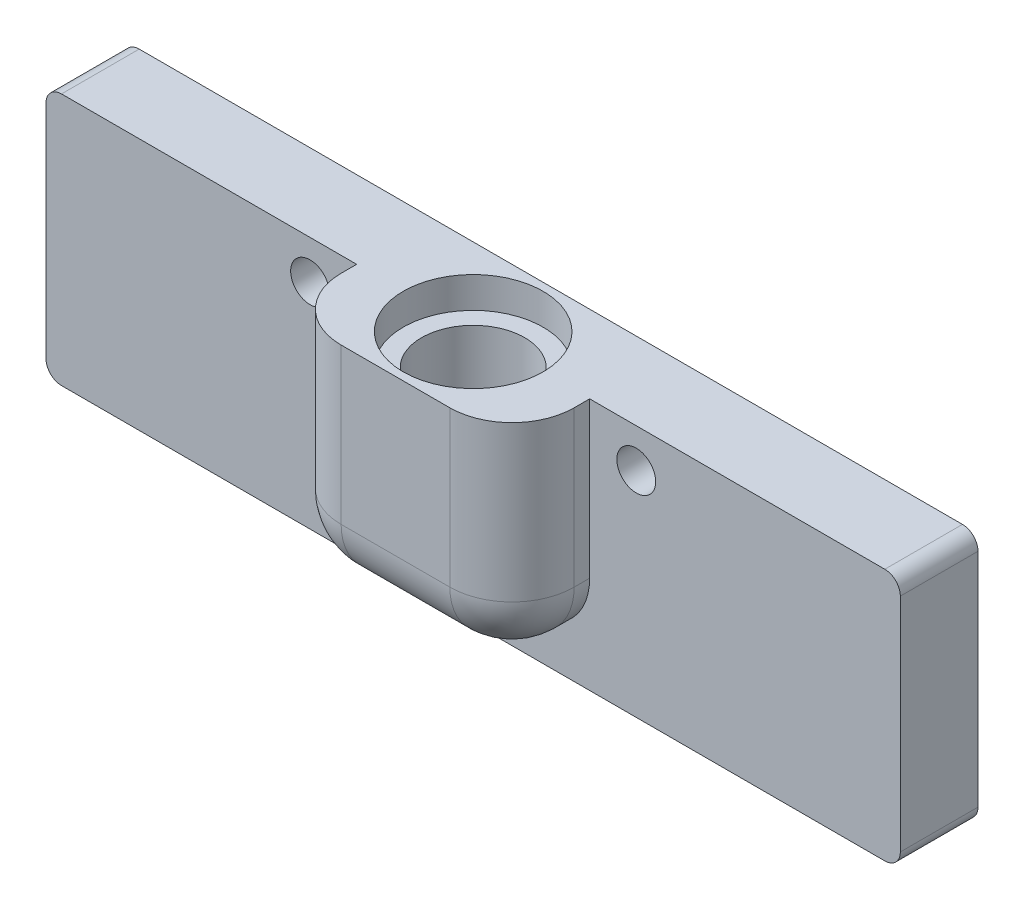
ISO-10303-21;
HEADER;
FILE_DESCRIPTION(('STEP AP214'),'2;1');
FILE_NAME('part.step','',(''),(''),'','','');
FILE_SCHEMA(('AUTOMOTIVE_DESIGN { 1 0 10303 214 1 1 1 1 }'));
ENDSEC;
DATA;
#1=APPLICATION_CONTEXT('core data for automotive mechanical design processes');
#2=APPLICATION_PROTOCOL_DEFINITION('international standard','automotive_design',2000,#1);
#3=PRODUCT_CONTEXT('',#1,'mechanical');
#4=PRODUCT('Part','Part','',(#3));
#5=PRODUCT_RELATED_PRODUCT_CATEGORY('part','',(#4));
#6=PRODUCT_DEFINITION_FORMATION('','',#4);
#7=PRODUCT_DEFINITION_CONTEXT('part definition',#1,'design');
#8=PRODUCT_DEFINITION('design','',#6,#7);
#9=PRODUCT_DEFINITION_SHAPE('','',#8);
#10=(LENGTH_UNIT() NAMED_UNIT(*) SI_UNIT(.MILLI.,.METRE.));
#11=(NAMED_UNIT(*) PLANE_ANGLE_UNIT() SI_UNIT($,.RADIAN.));
#12=(NAMED_UNIT(*) SI_UNIT($,.STERADIAN.) SOLID_ANGLE_UNIT());
#13=UNCERTAINTY_MEASURE_WITH_UNIT(LENGTH_MEASURE(1.E-05),#10,'distance_accuracy_value','');
#14=(GEOMETRIC_REPRESENTATION_CONTEXT(3) GLOBAL_UNCERTAINTY_ASSIGNED_CONTEXT((#13)) GLOBAL_UNIT_ASSIGNED_CONTEXT((#10,
#11,#12)) REPRESENTATION_CONTEXT('',''));
#15=CARTESIAN_POINT('',(0.,0.,0.));
#16=DIRECTION('',(0.,0.,1.));
#17=DIRECTION('',(1.,0.,0.));
#18=AXIS2_PLACEMENT_3D('',#15,#16,#17);
#19=CARTESIAN_POINT('',(0.,0.,5.));
#20=DIRECTION('',(0.,0.,-1.));
#21=DIRECTION('',(-1.,0.,0.));
#22=AXIS2_PLACEMENT_3D('',#19,#20,#21);
#23=PLANE('',#22);
#24=CARTESIAN_POINT('',(-10.5,-2.50000000679029,5.));
#25=DIRECTION('',(0.,0.,1.));
#26=DIRECTION('',(1.,0.,0.));
#27=AXIS2_PLACEMENT_3D('',#24,#25,#26);
#28=CIRCLE('',#27,1.24999999999999);
#29=CARTESIAN_POINT('',(-9.25000000000001,-2.50000000679029,5.));
#30=VERTEX_POINT('',#29);
#31=EDGE_CURVE('E291',#30,#30,#28,.T.);
#32=ORIENTED_EDGE('',*,*,#31,.F.);
#33=EDGE_LOOP('',(#32));
#34=FACE_BOUND('',#33,.T.);
#35=DIRECTION('',(-1.,0.,0.));
#36=VECTOR('',#35,1.);
#37=CARTESIAN_POINT('',(-27.5000000737673,-16.2630756067663,5.));
#38=LINE('',#37,#36);
#39=CARTESIAN_POINT('',(26.5,-16.2630756067663,5.));
#40=VERTEX_POINT('',#39);
#41=CARTESIAN_POINT('',(-26.5000000737673,-16.2630756067663,5.));
#42=VERTEX_POINT('',#41);
#43=EDGE_CURVE('E178',#40,#42,#38,.T.);
#44=ORIENTED_EDGE('',*,*,#43,.F.);
#45=CARTESIAN_POINT('',(26.5,-15.2630756067663,5.));
#46=DIRECTION('',(0.,0.,-1.));
#47=DIRECTION('',(-1.,0.,0.));
#48=AXIS2_PLACEMENT_3D('',#45,#46,#47);
#49=CIRCLE('',#48,1.);
#50=CARTESIAN_POINT('',(27.5,-15.2630756067663,5.));
#51=VERTEX_POINT('',#50);
#52=EDGE_CURVE('E437',#40,#51,#49,.F.);
#53=ORIENTED_EDGE('',*,*,#52,.T.);
#54=DIRECTION('',(0.,-1.,0.));
#55=VECTOR('',#54,1.);
#56=CARTESIAN_POINT('',(27.5,-6.79029728761856E-09,5.));
#57=LINE('',#56,#55);
#58=CARTESIAN_POINT('',(27.5,-1.0000000067903,5.));
#59=VERTEX_POINT('',#58);
#60=EDGE_CURVE('E199',#59,#51,#57,.T.);
#61=ORIENTED_EDGE('',*,*,#60,.F.);
#62=CARTESIAN_POINT('',(26.5,-1.0000000067903,5.));
#63=DIRECTION('',(0.,0.,-1.));
#64=DIRECTION('',(-1.,0.,0.));
#65=AXIS2_PLACEMENT_3D('',#62,#63,#64);
#66=CIRCLE('',#65,1.);
#67=CARTESIAN_POINT('',(26.5,-6.79029716515388E-09,5.));
#68=VERTEX_POINT('',#67);
#69=EDGE_CURVE('E440',#59,#68,#66,.F.);
#70=ORIENTED_EDGE('',*,*,#69,.T.);
#71=DIRECTION('',(1.,0.,0.));
#72=VECTOR('',#71,1.);
#73=CARTESIAN_POINT('',(-27.5000000737673,-6.79029055206115E-09,5.));
#74=LINE('',#73,#72);
#75=CARTESIAN_POINT('',(7.5,-6.79029483832496E-09,5.));
#76=VERTEX_POINT('',#75);
#77=EDGE_CURVE('E220',#76,#68,#74,.T.);
#78=ORIENTED_EDGE('',*,*,#77,.F.);
#79=DIRECTION('',(0.,1.,0.));
#80=VECTOR('',#79,1.);
#81=CARTESIAN_POINT('',(7.5,0.,5.));
#82=LINE('',#81,#80);
#83=CARTESIAN_POINT('',(7.5,-10.,5.));
#84=VERTEX_POINT('',#83);
#85=EDGE_CURVE('E173',#84,#76,#82,.T.);
#86=ORIENTED_EDGE('',*,*,#85,.F.);
#87=CARTESIAN_POINT('',(3.5,-10.,5.));
#88=DIRECTION('',(0.,0.,-1.));
#89=DIRECTION('',(-1.,0.,0.));
#90=AXIS2_PLACEMENT_3D('',#87,#88,#89);
#91=CIRCLE('',#90,4.);
#92=CARTESIAN_POINT('',(3.5,-14.,5.));
#93=VERTEX_POINT('',#92);
#94=EDGE_CURVE('E42',#84,#93,#91,.T.);
#95=ORIENTED_EDGE('',*,*,#94,.T.);
#96=DIRECTION('',(1.,0.,0.));
#97=VECTOR('',#96,1.);
#98=CARTESIAN_POINT('',(7.5,-14.,5.));
#99=LINE('',#98,#97);
#100=CARTESIAN_POINT('',(-3.5,-14.,5.));
#101=VERTEX_POINT('',#100);
#102=EDGE_CURVE('E162',#101,#93,#99,.T.);
#103=ORIENTED_EDGE('',*,*,#102,.F.);
#104=CARTESIAN_POINT('',(-3.5,-10.,5.));
#105=DIRECTION('',(0.,0.,-1.));
#106=DIRECTION('',(-1.,0.,0.));
#107=AXIS2_PLACEMENT_3D('',#104,#105,#106);
#108=CIRCLE('',#107,4.);
#109=CARTESIAN_POINT('',(-7.5,-10.,5.));
#110=VERTEX_POINT('',#109);
#111=EDGE_CURVE('E11',#101,#110,#108,.T.);
#112=ORIENTED_EDGE('',*,*,#111,.T.);
#113=DIRECTION('',(0.,-1.,0.));
#114=VECTOR('',#113,1.);
#115=CARTESIAN_POINT('',(-7.5,-14.,5.));
#116=LINE('',#115,#114);
#117=CARTESIAN_POINT('',(-7.5,-6.79029300135476E-09,5.));
#118=VERTEX_POINT('',#117);
#119=EDGE_CURVE('E159',#118,#110,#116,.T.);
#120=ORIENTED_EDGE('',*,*,#119,.F.);
#121=CARTESIAN_POINT('',(-26.5000000737673,-6.79029067452583E-09,5.));
#122=VERTEX_POINT('',#121);
#123=EDGE_CURVE('E216',#122,#118,#74,.T.);
#124=ORIENTED_EDGE('',*,*,#123,.F.);
#125=CARTESIAN_POINT('',(-26.5000000737673,-1.00000000679029,5.));
#126=DIRECTION('',(0.,0.,-1.));
#127=DIRECTION('',(-1.,0.,0.));
#128=AXIS2_PLACEMENT_3D('',#125,#126,#127);
#129=CIRCLE('',#128,1.);
#130=CARTESIAN_POINT('',(-27.5000000737673,-1.00000000679029,5.));
#131=VERTEX_POINT('',#130);
#132=EDGE_CURVE('E215',#122,#131,#129,.F.);
#133=ORIENTED_EDGE('',*,*,#132,.T.);
#134=DIRECTION('',(0.,1.,0.));
#135=VECTOR('',#134,1.);
#136=CARTESIAN_POINT('',(-27.5000000737673,-16.2630756067663,5.));
#137=LINE('',#136,#135);
#138=CARTESIAN_POINT('',(-27.5000000737673,-15.2630756067663,5.));
#139=VERTEX_POINT('',#138);
#140=EDGE_CURVE('E224',#139,#131,#137,.T.);
#141=ORIENTED_EDGE('',*,*,#140,.F.);
#142=CARTESIAN_POINT('',(-26.5000000737673,-15.2630756067663,5.));
#143=DIRECTION('',(0.,0.,-1.));
#144=DIRECTION('',(-1.,0.,0.));
#145=AXIS2_PLACEMENT_3D('',#142,#143,#144);
#146=CIRCLE('',#145,1.);
#147=EDGE_CURVE('E439',#139,#42,#146,.F.);
#148=ORIENTED_EDGE('',*,*,#147,.T.);
#149=EDGE_LOOP('',(#44,#53,#61,#70,#78,#86,#95,#103,#112,#120,#124,#133,#141,#148));
#150=FACE_BOUND('',#149,.T.);
#151=CARTESIAN_POINT('',(10.5,-2.50000000679029,5.));
#152=DIRECTION('',(0.,0.,1.));
#153=DIRECTION('',(1.,0.,0.));
#154=AXIS2_PLACEMENT_3D('',#151,#152,#153);
#155=CIRCLE('',#154,1.24999999999999);
#156=CARTESIAN_POINT('',(11.75,-2.50000000679029,5.));
#157=VERTEX_POINT('',#156);
#158=EDGE_CURVE('E285',#157,#157,#155,.T.);
#159=ORIENTED_EDGE('',*,*,#158,.F.);
#160=EDGE_LOOP('',(#159));
#161=FACE_BOUND('',#160,.T.);
#162=ADVANCED_FACE('F33',(#34,#150,#161),#23,.F.);
#163=CARTESIAN_POINT('',(-27.5000000737673,-16.2630756067663,5.));
#164=DIRECTION('',(0.,-1.,0.));
#165=DIRECTION('',(1.,0.,0.));
#166=AXIS2_PLACEMENT_3D('',#163,#164,#165);
#167=PLANE('',#166);
#168=DIRECTION('',(-1.,0.,0.));
#169=VECTOR('',#168,1.);
#170=CARTESIAN_POINT('',(-27.5000000737673,-16.2630756067663,0.));
#171=LINE('',#170,#169);
#172=CARTESIAN_POINT('',(26.5,-16.2630756067663,0.));
#173=VERTEX_POINT('',#172);
#174=CARTESIAN_POINT('',(-26.5000000737673,-16.2630756067663,0.));
#175=VERTEX_POINT('',#174);
#176=EDGE_CURVE('E239',#173,#175,#171,.T.);
#177=ORIENTED_EDGE('',*,*,#176,.F.);
#178=DIRECTION('',(0.,0.,-1.));
#179=VECTOR('',#178,1.);
#180=CARTESIAN_POINT('',(26.5,-16.2630756067663,5.));
#181=LINE('',#180,#179);
#182=EDGE_CURVE('E213',#173,#40,#181,.F.);
#183=ORIENTED_EDGE('',*,*,#182,.T.);
#184=ORIENTED_EDGE('',*,*,#43,.T.);
#185=DIRECTION('',(0.,0.,-1.));
#186=VECTOR('',#185,1.);
#187=CARTESIAN_POINT('',(-26.5000000737673,-16.2630756067663,5.));
#188=LINE('',#187,#186);
#189=EDGE_CURVE('E210',#42,#175,#188,.T.);
#190=ORIENTED_EDGE('',*,*,#189,.T.);
#191=EDGE_LOOP('',(#177,#183,#184,#190));
#192=FACE_BOUND('',#191,.T.);
#193=ADVANCED_FACE('F298',(#192),#167,.T.);
#194=CARTESIAN_POINT('',(27.5,-6.79029728761856E-09,5.));
#195=DIRECTION('',(1.,0.,0.));
#196=DIRECTION('',(0.,1.,0.));
#197=AXIS2_PLACEMENT_3D('',#194,#195,#196);
#198=PLANE('',#197);
#199=ORIENTED_EDGE('',*,*,#60,.T.);
#200=DIRECTION('',(0.,0.,-1.));
#201=VECTOR('',#200,1.);
#202=CARTESIAN_POINT('',(27.5,-15.2630756067663,5.));
#203=LINE('',#202,#201);
#204=CARTESIAN_POINT('',(27.5,-15.2630756067663,0.));
#205=VERTEX_POINT('',#204);
#206=EDGE_CURVE('E198',#51,#205,#203,.T.);
#207=ORIENTED_EDGE('',*,*,#206,.T.);
#208=DIRECTION('',(0.,-1.,0.));
#209=VECTOR('',#208,1.);
#210=CARTESIAN_POINT('',(27.5,-6.79029728761856E-09,0.));
#211=LINE('',#210,#209);
#212=CARTESIAN_POINT('',(27.5,-1.0000000067903,0.));
#213=VERTEX_POINT('',#212);
#214=EDGE_CURVE('E230',#213,#205,#211,.T.);
#215=ORIENTED_EDGE('',*,*,#214,.F.);
#216=DIRECTION('',(0.,0.,-1.));
#217=VECTOR('',#216,1.);
#218=CARTESIAN_POINT('',(27.5,-1.0000000067903,5.));
#219=LINE('',#218,#217);
#220=EDGE_CURVE('E196',#213,#59,#219,.F.);
#221=ORIENTED_EDGE('',*,*,#220,.T.);
#222=EDGE_LOOP('',(#199,#207,#215,#221));
#223=FACE_BOUND('',#222,.T.);
#224=ADVANCED_FACE('F352',(#223),#198,.T.);
#225=CARTESIAN_POINT('',(-27.5000000737673,-6.79029055206115E-09,5.));
#226=DIRECTION('',(0.,1.,0.));
#227=DIRECTION('',(-1.,0.,0.));
#228=AXIS2_PLACEMENT_3D('',#225,#226,#227);
#229=PLANE('',#228);
#230=CARTESIAN_POINT('',(0.,0.,5.));
#231=DIRECTION('',(0.,1.,0.));
#232=DIRECTION('',(0.,0.,1.));
#233=AXIS2_PLACEMENT_3D('',#230,#231,#232);
#234=CIRCLE('',#233,4.49999999999999);
#235=CARTESIAN_POINT('',(0.,0.,9.49999999999999));
#236=VERTEX_POINT('',#235);
#237=EDGE_CURVE('E275',#236,#236,#234,.T.);
#238=ORIENTED_EDGE('',*,*,#237,.F.);
#239=EDGE_LOOP('',(#238));
#240=FACE_BOUND('',#239,.T.);
#241=DIRECTION('',(-1.,0.,0.));
#242=VECTOR('',#241,1.);
#243=CARTESIAN_POINT('',(-7.5,0.,10.));
#244=LINE('',#243,#242);
#245=CARTESIAN_POINT('',(3.5,0.,10.));
#246=VERTEX_POINT('',#245);
#247=CARTESIAN_POINT('',(-3.5,0.,10.));
#248=VERTEX_POINT('',#247);
#249=EDGE_CURVE('E169',#246,#248,#244,.T.);
#250=ORIENTED_EDGE('',*,*,#249,.F.);
#251=CARTESIAN_POINT('',(3.5,-6.79029434846624E-09,6.));
#252=DIRECTION('',(0.,1.,0.));
#253=DIRECTION('',(-1.,0.,0.));
#254=AXIS2_PLACEMENT_3D('',#251,#252,#253);
#255=CIRCLE('',#254,4.);
#256=CARTESIAN_POINT('',(7.5,0.,6.));
#257=VERTEX_POINT('',#256);
#258=EDGE_CURVE('E251',#246,#257,#255,.T.);
#259=ORIENTED_EDGE('',*,*,#258,.T.);
#260=DIRECTION('',(0.,0.,-1.));
#261=VECTOR('',#260,1.);
#262=CARTESIAN_POINT('',(7.5,0.,10.));
#263=LINE('',#262,#261);
#264=EDGE_CURVE('E172',#257,#76,#263,.T.);
#265=ORIENTED_EDGE('',*,*,#264,.T.);
#266=ORIENTED_EDGE('',*,*,#77,.T.);
#267=DIRECTION('',(0.,0.,-1.));
#268=VECTOR('',#267,1.);
#269=CARTESIAN_POINT('',(26.5,-6.79029716515388E-09,5.));
#270=LINE('',#269,#268);
#271=CARTESIAN_POINT('',(26.5,-6.79029716515388E-09,0.));
#272=VERTEX_POINT('',#271);
#273=EDGE_CURVE('E184',#68,#272,#270,.T.);
#274=ORIENTED_EDGE('',*,*,#273,.T.);
#275=DIRECTION('',(1.,0.,0.));
#276=VECTOR('',#275,1.);
#277=CARTESIAN_POINT('',(-27.5000000737673,-6.79029055206115E-09,0.));
#278=LINE('',#277,#276);
#279=CARTESIAN_POINT('',(-26.5000000737673,-6.79029067452583E-09,0.));
#280=VERTEX_POINT('',#279);
#281=EDGE_CURVE('E234',#280,#272,#278,.T.);
#282=ORIENTED_EDGE('',*,*,#281,.F.);
#283=DIRECTION('',(0.,0.,-1.));
#284=VECTOR('',#283,1.);
#285=CARTESIAN_POINT('',(-26.5000000737673,-6.79029067452583E-09,5.));
#286=LINE('',#285,#284);
#287=EDGE_CURVE('E426',#280,#122,#286,.F.);
#288=ORIENTED_EDGE('',*,*,#287,.T.);
#289=ORIENTED_EDGE('',*,*,#123,.T.);
#290=DIRECTION('',(0.,0.,-1.));
#291=VECTOR('',#290,1.);
#292=CARTESIAN_POINT('',(-7.5,0.,10.));
#293=LINE('',#292,#291);
#294=CARTESIAN_POINT('',(-7.5,0.,6.));
#295=VERTEX_POINT('',#294);
#296=EDGE_CURVE('E188',#295,#118,#293,.T.);
#297=ORIENTED_EDGE('',*,*,#296,.F.);
#298=CARTESIAN_POINT('',(-3.5,-6.79029349121348E-09,6.));
#299=DIRECTION('',(0.,1.,0.));
#300=DIRECTION('',(-1.,0.,0.));
#301=AXIS2_PLACEMENT_3D('',#298,#299,#300);
#302=CIRCLE('',#301,4.);
#303=EDGE_CURVE('E249',#295,#248,#302,.T.);
#304=ORIENTED_EDGE('',*,*,#303,.T.);
#305=EDGE_LOOP('',(#250,#259,#265,#266,#274,#282,#288,#289,#297,#304));
#306=FACE_BOUND('',#305,.T.);
#307=ADVANCED_FACE('F355',(#240,#306),#229,.T.);
#308=CARTESIAN_POINT('',(-27.5000000737673,-16.2630756067663,5.));
#309=DIRECTION('',(-1.,0.,0.));
#310=DIRECTION('',(0.,0.,1.));
#311=AXIS2_PLACEMENT_3D('',#308,#309,#310);
#312=PLANE('',#311);
#313=DIRECTION('',(0.,1.,0.));
#314=VECTOR('',#313,1.);
#315=CARTESIAN_POINT('',(-27.5000000737673,-16.2630756067663,0.));
#316=LINE('',#315,#314);
#317=CARTESIAN_POINT('',(-27.5000000737673,-15.2630756067663,0.));
#318=VERTEX_POINT('',#317);
#319=CARTESIAN_POINT('',(-27.5000000737673,-1.00000000679029,0.));
#320=VERTEX_POINT('',#319);
#321=EDGE_CURVE('E237',#318,#320,#316,.T.);
#322=ORIENTED_EDGE('',*,*,#321,.F.);
#323=DIRECTION('',(0.,0.,-1.));
#324=VECTOR('',#323,1.);
#325=CARTESIAN_POINT('',(-27.5000000737673,-15.2630756067663,5.));
#326=LINE('',#325,#324);
#327=EDGE_CURVE('E429',#318,#139,#326,.F.);
#328=ORIENTED_EDGE('',*,*,#327,.T.);
#329=ORIENTED_EDGE('',*,*,#140,.T.);
#330=DIRECTION('',(0.,0.,-1.));
#331=VECTOR('',#330,1.);
#332=CARTESIAN_POINT('',(-27.5000000737673,-1.00000000679029,5.));
#333=LINE('',#332,#331);
#334=EDGE_CURVE('E432',#131,#320,#333,.T.);
#335=ORIENTED_EDGE('',*,*,#334,.T.);
#336=EDGE_LOOP('',(#322,#328,#329,#335));
#337=FACE_BOUND('',#336,.T.);
#338=ADVANCED_FACE('F350',(#337),#312,.T.);
#339=CARTESIAN_POINT('',(0.,0.,0.));
#340=DIRECTION('',(0.,0.,-1.));
#341=DIRECTION('',(-1.,0.,0.));
#342=AXIS2_PLACEMENT_3D('',#339,#340,#341);
#343=PLANE('',#342);
#344=CARTESIAN_POINT('',(-10.5,-2.50000000679029,0.));
#345=DIRECTION('',(0.,0.,1.));
#346=DIRECTION('',(1.,0.,0.));
#347=AXIS2_PLACEMENT_3D('',#344,#345,#346);
#348=CIRCLE('',#347,1.25);
#349=CARTESIAN_POINT('',(-9.25,-2.50000000679029,0.));
#350=VERTEX_POINT('',#349);
#351=EDGE_CURVE('E288',#350,#350,#348,.T.);
#352=ORIENTED_EDGE('',*,*,#351,.T.);
#353=EDGE_LOOP('',(#352));
#354=FACE_BOUND('',#353,.T.);
#355=CARTESIAN_POINT('',(10.5,-2.50000000679029,0.));
#356=DIRECTION('',(0.,0.,1.));
#357=DIRECTION('',(1.,0.,0.));
#358=AXIS2_PLACEMENT_3D('',#355,#356,#357);
#359=CIRCLE('',#358,1.25);
#360=CARTESIAN_POINT('',(11.75,-2.50000000679029,0.));
#361=VERTEX_POINT('',#360);
#362=EDGE_CURVE('E261',#361,#361,#359,.T.);
#363=ORIENTED_EDGE('',*,*,#362,.T.);
#364=EDGE_LOOP('',(#363));
#365=FACE_BOUND('',#364,.T.);
#366=ORIENTED_EDGE('',*,*,#214,.T.);
#367=CARTESIAN_POINT('',(26.5,-15.2630756067663,0.));
#368=DIRECTION('',(0.,0.,-1.));
#369=DIRECTION('',(-1.,0.,0.));
#370=AXIS2_PLACEMENT_3D('',#367,#368,#369);
#371=CIRCLE('',#370,1.);
#372=EDGE_CURVE('E208',#205,#173,#371,.T.);
#373=ORIENTED_EDGE('',*,*,#372,.T.);
#374=ORIENTED_EDGE('',*,*,#176,.T.);
#375=CARTESIAN_POINT('',(-26.5000000737673,-15.2630756067663,0.));
#376=DIRECTION('',(0.,0.,-1.));
#377=DIRECTION('',(-1.,0.,0.));
#378=AXIS2_PLACEMENT_3D('',#375,#376,#377);
#379=CIRCLE('',#378,1.);
#380=EDGE_CURVE('E206',#175,#318,#379,.T.);
#381=ORIENTED_EDGE('',*,*,#380,.T.);
#382=ORIENTED_EDGE('',*,*,#321,.T.);
#383=CARTESIAN_POINT('',(-26.5000000737673,-1.00000000679029,0.));
#384=DIRECTION('',(0.,0.,-1.));
#385=DIRECTION('',(-1.,0.,0.));
#386=AXIS2_PLACEMENT_3D('',#383,#384,#385);
#387=CIRCLE('',#386,1.);
#388=EDGE_CURVE('E202',#320,#280,#387,.T.);
#389=ORIENTED_EDGE('',*,*,#388,.T.);
#390=ORIENTED_EDGE('',*,*,#281,.T.);
#391=CARTESIAN_POINT('',(26.5,-1.0000000067903,0.));
#392=DIRECTION('',(0.,0.,-1.));
#393=DIRECTION('',(-1.,0.,0.));
#394=AXIS2_PLACEMENT_3D('',#391,#392,#393);
#395=CIRCLE('',#394,1.);
#396=EDGE_CURVE('E204',#272,#213,#395,.T.);
#397=ORIENTED_EDGE('',*,*,#396,.T.);
#398=EDGE_LOOP('',(#366,#373,#374,#381,#382,#389,#390,#397));
#399=FACE_BOUND('',#398,.T.);
#400=ADVANCED_FACE('F346',(#354,#365,#399),#343,.T.);
#401=CARTESIAN_POINT('',(-7.5,-14.,10.));
#402=DIRECTION('',(1.,0.,0.));
#403=DIRECTION('',(0.,1.,0.));
#404=AXIS2_PLACEMENT_3D('',#401,#402,#403);
#405=PLANE('',#404);
#406=ORIENTED_EDGE('',*,*,#119,.T.);
#407=DIRECTION('',(0.,0.,-1.));
#408=VECTOR('',#407,1.);
#409=CARTESIAN_POINT('',(-7.5,-10.,10.));
#410=LINE('',#409,#408);
#411=CARTESIAN_POINT('',(-7.5,-10.,6.));
#412=VERTEX_POINT('',#411);
#413=EDGE_CURVE('E50',#110,#412,#410,.F.);
#414=ORIENTED_EDGE('',*,*,#413,.T.);
#415=DIRECTION('',(0.,-1.,0.));
#416=VECTOR('',#415,1.);
#417=CARTESIAN_POINT('',(-7.5,-14.,6.));
#418=LINE('',#417,#416);
#419=EDGE_CURVE('E253',#412,#295,#418,.F.);
#420=ORIENTED_EDGE('',*,*,#419,.T.);
#421=ORIENTED_EDGE('',*,*,#296,.T.);
#422=EDGE_LOOP('',(#406,#414,#420,#421));
#423=FACE_BOUND('',#422,.T.);
#424=ADVANCED_FACE('F343',(#423),#405,.F.);
#425=CARTESIAN_POINT('',(7.5,-14.,10.));
#426=DIRECTION('',(0.,1.,0.));
#427=DIRECTION('',(0.,0.,1.));
#428=AXIS2_PLACEMENT_3D('',#425,#426,#427);
#429=PLANE('',#428);
#430=ORIENTED_EDGE('',*,*,#102,.T.);
#431=DIRECTION('',(0.,0.,-1.));
#432=VECTOR('',#431,1.);
#433=CARTESIAN_POINT('',(3.5,-14.,10.));
#434=LINE('',#433,#432);
#435=CARTESIAN_POINT('',(3.5,-14.,6.));
#436=VERTEX_POINT('',#435);
#437=EDGE_CURVE('E412',#93,#436,#434,.F.);
#438=ORIENTED_EDGE('',*,*,#437,.T.);
#439=DIRECTION('',(1.,0.,0.));
#440=VECTOR('',#439,1.);
#441=CARTESIAN_POINT('',(7.5,-14.,6.));
#442=LINE('',#441,#440);
#443=CARTESIAN_POINT('',(-3.5,-14.,6.));
#444=VERTEX_POINT('',#443);
#445=EDGE_CURVE('E418',#436,#444,#442,.F.);
#446=ORIENTED_EDGE('',*,*,#445,.T.);
#447=DIRECTION('',(0.,0.,-1.));
#448=VECTOR('',#447,1.);
#449=CARTESIAN_POINT('',(-3.5,-14.,10.));
#450=LINE('',#449,#448);
#451=EDGE_CURVE('E416',#444,#101,#450,.T.);
#452=ORIENTED_EDGE('',*,*,#451,.T.);
#453=EDGE_LOOP('',(#430,#438,#446,#452));
#454=FACE_BOUND('',#453,.T.);
#455=ADVANCED_FACE('F339',(#454),#429,.F.);
#456=CARTESIAN_POINT('',(7.5,0.,10.));
#457=DIRECTION('',(-1.,0.,0.));
#458=DIRECTION('',(0.,0.,1.));
#459=AXIS2_PLACEMENT_3D('',#456,#457,#458);
#460=PLANE('',#459);
#461=DIRECTION('',(0.,1.,0.));
#462=VECTOR('',#461,1.);
#463=CARTESIAN_POINT('',(7.5,0.,6.));
#464=LINE('',#463,#462);
#465=CARTESIAN_POINT('',(7.5,-10.,6.));
#466=VERTEX_POINT('',#465);
#467=EDGE_CURVE('E189',#257,#466,#464,.F.);
#468=ORIENTED_EDGE('',*,*,#467,.T.);
#469=DIRECTION('',(0.,0.,-1.));
#470=VECTOR('',#469,1.);
#471=CARTESIAN_POINT('',(7.5,-10.,10.));
#472=LINE('',#471,#470);
#473=EDGE_CURVE('E419',#466,#84,#472,.T.);
#474=ORIENTED_EDGE('',*,*,#473,.T.);
#475=ORIENTED_EDGE('',*,*,#85,.T.);
#476=ORIENTED_EDGE('',*,*,#264,.F.);
#477=EDGE_LOOP('',(#468,#474,#475,#476));
#478=FACE_BOUND('',#477,.T.);
#479=ADVANCED_FACE('F335',(#478),#460,.F.);
#480=CARTESIAN_POINT('',(0.,0.,10.));
#481=DIRECTION('',(0.,0.,-1.));
#482=DIRECTION('',(-1.,0.,0.));
#483=AXIS2_PLACEMENT_3D('',#480,#481,#482);
#484=PLANE('',#483);
#485=DIRECTION('',(1.,0.,0.));
#486=VECTOR('',#485,1.);
#487=CARTESIAN_POINT('',(0.,-10.,10.));
#488=LINE('',#487,#486);
#489=CARTESIAN_POINT('',(-3.5,-10.,10.));
#490=VERTEX_POINT('',#489);
#491=CARTESIAN_POINT('',(3.5,-10.,10.));
#492=VERTEX_POINT('',#491);
#493=EDGE_CURVE('E409',#490,#492,#488,.T.);
#494=ORIENTED_EDGE('',*,*,#493,.T.);
#495=DIRECTION('',(0.,1.,0.));
#496=VECTOR('',#495,1.);
#497=CARTESIAN_POINT('',(3.5,0.,10.));
#498=LINE('',#497,#496);
#499=EDGE_CURVE('E247',#492,#246,#498,.T.);
#500=ORIENTED_EDGE('',*,*,#499,.T.);
#501=ORIENTED_EDGE('',*,*,#249,.T.);
#502=DIRECTION('',(0.,-1.,0.));
#503=VECTOR('',#502,1.);
#504=CARTESIAN_POINT('',(-3.5,0.,10.));
#505=LINE('',#504,#503);
#506=EDGE_CURVE('E403',#248,#490,#505,.T.);
#507=ORIENTED_EDGE('',*,*,#506,.T.);
#508=EDGE_LOOP('',(#494,#500,#501,#507));
#509=FACE_BOUND('',#508,.T.);
#510=ADVANCED_FACE('F153',(#509),#484,.F.);
#511=CARTESIAN_POINT('',(0.,-9.99999999999999,5.));
#512=DIRECTION('',(0.,1.,0.));
#513=DIRECTION('',(0.,0.,1.));
#514=AXIS2_PLACEMENT_3D('',#511,#512,#513);
#515=CONICAL_SURFACE('',#514,3.3235,1.0297442587514);
#516=CARTESIAN_POINT('',(0.,-11.996960267,5.));
#517=VERTEX_POINT('',#516);
#518=VERTEX_LOOP('',#517);
#519=FACE_BOUND('',#518,.T.);
#520=CARTESIAN_POINT('',(0.,-9.99999999999999,5.));
#521=DIRECTION('',(0.,1.,0.));
#522=DIRECTION('',(0.,0.,1.));
#523=AXIS2_PLACEMENT_3D('',#520,#521,#522);
#524=CIRCLE('',#523,3.3235);
#525=CARTESIAN_POINT('',(0.,-9.99999999999999,8.3235));
#526=VERTEX_POINT('',#525);
#527=EDGE_CURVE('E157',#526,#526,#524,.T.);
#528=ORIENTED_EDGE('',*,*,#527,.T.);
#529=EDGE_LOOP('',(#528));
#530=FACE_BOUND('',#529,.T.);
#531=ADVANCED_FACE('F149',(#519,#530),#515,.F.);
#532=CARTESIAN_POINT('',(0.,0.,5.));
#533=DIRECTION('',(0.,1.,0.));
#534=DIRECTION('',(0.,0.,1.));
#535=AXIS2_PLACEMENT_3D('',#532,#533,#534);
#536=CYLINDRICAL_SURFACE('',#535,3.3235);
#537=ORIENTED_EDGE('',*,*,#527,.F.);
#538=EDGE_LOOP('',(#537));
#539=FACE_BOUND('',#538,.T.);
#540=CARTESIAN_POINT('',(0.,-2.,5.));
#541=DIRECTION('',(0.,1.,0.));
#542=DIRECTION('',(0.,0.,1.));
#543=AXIS2_PLACEMENT_3D('',#540,#541,#542);
#544=CIRCLE('',#543,3.3235);
#545=CARTESIAN_POINT('',(0.,-2.,8.3235));
#546=VERTEX_POINT('',#545);
#547=EDGE_CURVE('E160',#546,#546,#544,.T.);
#548=ORIENTED_EDGE('',*,*,#547,.T.);
#549=EDGE_LOOP('',(#548));
#550=FACE_BOUND('',#549,.T.);
#551=ADVANCED_FACE('F152',(#539,#550),#536,.F.);
#552=CARTESIAN_POINT('',(3.3235,-2.,5.));
#553=DIRECTION('',(0.,-1.,0.));
#554=DIRECTION('',(0.,0.,-1.));
#555=AXIS2_PLACEMENT_3D('',#552,#553,#554);
#556=PLANE('',#555);
#557=ORIENTED_EDGE('',*,*,#547,.F.);
#558=EDGE_LOOP('',(#557));
#559=FACE_BOUND('',#558,.T.);
#560=CARTESIAN_POINT('',(0.,-2.,5.));
#561=DIRECTION('',(0.,1.,0.));
#562=DIRECTION('',(0.,0.,1.));
#563=AXIS2_PLACEMENT_3D('',#560,#561,#562);
#564=CIRCLE('',#563,4.49999999999999);
#565=CARTESIAN_POINT('',(0.,-2.,9.49999999999999));
#566=VERTEX_POINT('',#565);
#567=EDGE_CURVE('E165',#566,#566,#564,.T.);
#568=ORIENTED_EDGE('',*,*,#567,.T.);
#569=EDGE_LOOP('',(#568));
#570=FACE_BOUND('',#569,.T.);
#571=ADVANCED_FACE('F326',(#559,#570),#556,.F.);
#572=CARTESIAN_POINT('',(0.,0.,5.));
#573=DIRECTION('',(0.,1.,0.));
#574=DIRECTION('',(0.,0.,1.));
#575=AXIS2_PLACEMENT_3D('',#572,#573,#574);
#576=CYLINDRICAL_SURFACE('',#575,4.49999999999999);
#577=ORIENTED_EDGE('',*,*,#567,.F.);
#578=EDGE_LOOP('',(#577));
#579=FACE_BOUND('',#578,.T.);
#580=ORIENTED_EDGE('',*,*,#237,.T.);
#581=EDGE_LOOP('',(#580));
#582=FACE_BOUND('',#581,.T.);
#583=ADVANCED_FACE('F322',(#579,#582),#576,.F.);
#584=CARTESIAN_POINT('',(26.5,-15.2630756067663,5.));
#585=DIRECTION('',(0.,0.,-1.));
#586=DIRECTION('',(-1.,0.,0.));
#587=AXIS2_PLACEMENT_3D('',#584,#585,#586);
#588=CYLINDRICAL_SURFACE('',#587,1.);
#589=ORIENTED_EDGE('',*,*,#52,.F.);
#590=ORIENTED_EDGE('',*,*,#182,.F.);
#591=ORIENTED_EDGE('',*,*,#372,.F.);
#592=ORIENTED_EDGE('',*,*,#206,.F.);
#593=EDGE_LOOP('',(#589,#590,#591,#592));
#594=FACE_BOUND('',#593,.T.);
#595=ADVANCED_FACE('F325',(#594),#588,.T.);
#596=CARTESIAN_POINT('',(-26.5000000737673,-15.2630756067663,5.));
#597=DIRECTION('',(0.,0.,-1.));
#598=DIRECTION('',(-1.,0.,0.));
#599=AXIS2_PLACEMENT_3D('',#596,#597,#598);
#600=CYLINDRICAL_SURFACE('',#599,1.);
#601=ORIENTED_EDGE('',*,*,#147,.F.);
#602=ORIENTED_EDGE('',*,*,#327,.F.);
#603=ORIENTED_EDGE('',*,*,#380,.F.);
#604=ORIENTED_EDGE('',*,*,#189,.F.);
#605=EDGE_LOOP('',(#601,#602,#603,#604));
#606=FACE_BOUND('',#605,.T.);
#607=ADVANCED_FACE('F368',(#606),#600,.T.);
#608=CARTESIAN_POINT('',(26.5,-1.0000000067903,5.));
#609=DIRECTION('',(0.,0.,-1.));
#610=DIRECTION('',(-1.,0.,0.));
#611=AXIS2_PLACEMENT_3D('',#608,#609,#610);
#612=CYLINDRICAL_SURFACE('',#611,1.);
#613=ORIENTED_EDGE('',*,*,#69,.F.);
#614=ORIENTED_EDGE('',*,*,#220,.F.);
#615=ORIENTED_EDGE('',*,*,#396,.F.);
#616=ORIENTED_EDGE('',*,*,#273,.F.);
#617=EDGE_LOOP('',(#613,#614,#615,#616));
#618=FACE_BOUND('',#617,.T.);
#619=ADVANCED_FACE('F372',(#618),#612,.T.);
#620=CARTESIAN_POINT('',(-26.5000000737673,-1.00000000679029,5.));
#621=DIRECTION('',(0.,0.,-1.));
#622=DIRECTION('',(-1.,0.,0.));
#623=AXIS2_PLACEMENT_3D('',#620,#621,#622);
#624=CYLINDRICAL_SURFACE('',#623,1.);
#625=ORIENTED_EDGE('',*,*,#132,.F.);
#626=ORIENTED_EDGE('',*,*,#287,.F.);
#627=ORIENTED_EDGE('',*,*,#388,.F.);
#628=ORIENTED_EDGE('',*,*,#334,.F.);
#629=EDGE_LOOP('',(#625,#626,#627,#628));
#630=FACE_BOUND('',#629,.T.);
#631=ADVANCED_FACE('F376',(#630),#624,.T.);
#632=CARTESIAN_POINT('',(-3.5,-10.,10.));
#633=DIRECTION('',(0.,0.,-1.));
#634=DIRECTION('',(-1.,0.,0.));
#635=AXIS2_PLACEMENT_3D('',#632,#633,#634);
#636=CYLINDRICAL_SURFACE('',#635,4.);
#637=ORIENTED_EDGE('',*,*,#111,.F.);
#638=ORIENTED_EDGE('',*,*,#451,.F.);
#639=CARTESIAN_POINT('',(-3.5,-10.,6.));
#640=DIRECTION('',(0.,0.,1.));
#641=DIRECTION('',(1.,0.,0.));
#642=AXIS2_PLACEMENT_3D('',#639,#640,#641);
#643=CIRCLE('',#642,4.);
#644=EDGE_CURVE('E37',#412,#444,#643,.T.);
#645=ORIENTED_EDGE('',*,*,#644,.F.);
#646=ORIENTED_EDGE('',*,*,#413,.F.);
#647=EDGE_LOOP('',(#637,#638,#645,#646));
#648=FACE_BOUND('',#647,.T.);
#649=ADVANCED_FACE('F35',(#648),#636,.T.);
#650=CARTESIAN_POINT('',(-3.5,0.,6.));
#651=DIRECTION('',(0.,-1.,0.));
#652=DIRECTION('',(1.,0.,0.));
#653=AXIS2_PLACEMENT_3D('',#650,#651,#652);
#654=CYLINDRICAL_SURFACE('',#653,4.);
#655=ORIENTED_EDGE('',*,*,#303,.F.);
#656=ORIENTED_EDGE('',*,*,#419,.F.);
#657=CARTESIAN_POINT('',(-3.5,-10.,6.));
#658=DIRECTION('',(0.,-1.,0.));
#659=DIRECTION('',(0.,0.,-1.));
#660=AXIS2_PLACEMENT_3D('',#657,#658,#659);
#661=CIRCLE('',#660,4.);
#662=EDGE_CURVE('E269',#490,#412,#661,.T.);
#663=ORIENTED_EDGE('',*,*,#662,.F.);
#664=ORIENTED_EDGE('',*,*,#506,.F.);
#665=EDGE_LOOP('',(#655,#656,#663,#664));
#666=FACE_BOUND('',#665,.T.);
#667=ADVANCED_FACE('F394',(#666),#654,.T.);
#668=CARTESIAN_POINT('',(-3.5,-10.,6.));
#669=DIRECTION('',(0.,0.,1.));
#670=DIRECTION('',(1.,0.,0.));
#671=AXIS2_PLACEMENT_3D('',#668,#669,#670);
#672=SPHERICAL_SURFACE('',#671,4.);
#673=ORIENTED_EDGE('',*,*,#662,.T.);
#674=ORIENTED_EDGE('',*,*,#644,.T.);
#675=CARTESIAN_POINT('',(-3.5,-10.,6.));
#676=DIRECTION('',(-1.,0.,0.));
#677=DIRECTION('',(0.,0.,1.));
#678=AXIS2_PLACEMENT_3D('',#675,#676,#677);
#679=CIRCLE('',#678,4.);
#680=EDGE_CURVE('E267',#490,#444,#679,.F.);
#681=ORIENTED_EDGE('',*,*,#680,.F.);
#682=EDGE_LOOP('',(#673,#674,#681));
#683=FACE_BOUND('',#682,.T.);
#684=ADVANCED_FACE('F391',(#683),#672,.T.);
#685=CARTESIAN_POINT('',(0.,-10.,6.));
#686=DIRECTION('',(1.,0.,0.));
#687=DIRECTION('',(0.,0.,-1.));
#688=AXIS2_PLACEMENT_3D('',#685,#686,#687);
#689=CYLINDRICAL_SURFACE('',#688,4.);
#690=ORIENTED_EDGE('',*,*,#680,.T.);
#691=ORIENTED_EDGE('',*,*,#445,.F.);
#692=CARTESIAN_POINT('',(3.5,-10.,6.));
#693=DIRECTION('',(1.,0.,0.));
#694=DIRECTION('',(0.,0.,-1.));
#695=AXIS2_PLACEMENT_3D('',#692,#693,#694);
#696=CIRCLE('',#695,4.);
#697=EDGE_CURVE('E264',#492,#436,#696,.T.);
#698=ORIENTED_EDGE('',*,*,#697,.F.);
#699=ORIENTED_EDGE('',*,*,#493,.F.);
#700=EDGE_LOOP('',(#690,#691,#698,#699));
#701=FACE_BOUND('',#700,.T.);
#702=ADVANCED_FACE('F387',(#701),#689,.T.);
#703=CARTESIAN_POINT('',(3.5,0.,6.));
#704=DIRECTION('',(0.,1.,0.));
#705=DIRECTION('',(0.,0.,1.));
#706=AXIS2_PLACEMENT_3D('',#703,#704,#705);
#707=CYLINDRICAL_SURFACE('',#706,4.);
#708=ORIENTED_EDGE('',*,*,#258,.F.);
#709=ORIENTED_EDGE('',*,*,#499,.F.);
#710=CARTESIAN_POINT('',(3.5,-10.,6.));
#711=DIRECTION('',(0.,-1.,0.));
#712=DIRECTION('',(0.,0.,-1.));
#713=AXIS2_PLACEMENT_3D('',#710,#711,#712);
#714=CIRCLE('',#713,4.);
#715=EDGE_CURVE('E260',#466,#492,#714,.T.);
#716=ORIENTED_EDGE('',*,*,#715,.F.);
#717=ORIENTED_EDGE('',*,*,#467,.F.);
#718=EDGE_LOOP('',(#708,#709,#716,#717));
#719=FACE_BOUND('',#718,.T.);
#720=ADVANCED_FACE('F383',(#719),#707,.T.);
#721=CARTESIAN_POINT('',(3.5,-10.,6.));
#722=DIRECTION('',(0.,0.,1.));
#723=DIRECTION('',(1.,0.,0.));
#724=AXIS2_PLACEMENT_3D('',#721,#722,#723);
#725=SPHERICAL_SURFACE('',#724,4.);
#726=ORIENTED_EDGE('',*,*,#715,.T.);
#727=ORIENTED_EDGE('',*,*,#697,.T.);
#728=CARTESIAN_POINT('',(3.5,-10.,6.));
#729=DIRECTION('',(0.,0.,1.));
#730=DIRECTION('',(1.,0.,0.));
#731=AXIS2_PLACEMENT_3D('',#728,#729,#730);
#732=CIRCLE('',#731,4.);
#733=EDGE_CURVE('E257',#466,#436,#732,.F.);
#734=ORIENTED_EDGE('',*,*,#733,.F.);
#735=EDGE_LOOP('',(#726,#727,#734));
#736=FACE_BOUND('',#735,.T.);
#737=ADVANCED_FACE('F317',(#736),#725,.T.);
#738=CARTESIAN_POINT('',(3.5,-10.,10.));
#739=DIRECTION('',(0.,0.,-1.));
#740=DIRECTION('',(-1.,0.,0.));
#741=AXIS2_PLACEMENT_3D('',#738,#739,#740);
#742=CYLINDRICAL_SURFACE('',#741,4.);
#743=ORIENTED_EDGE('',*,*,#733,.T.);
#744=ORIENTED_EDGE('',*,*,#437,.F.);
#745=ORIENTED_EDGE('',*,*,#94,.F.);
#746=ORIENTED_EDGE('',*,*,#473,.F.);
#747=EDGE_LOOP('',(#743,#744,#745,#746));
#748=FACE_BOUND('',#747,.T.);
#749=ADVANCED_FACE('F308',(#748),#742,.T.);
#750=CARTESIAN_POINT('',(10.5,-2.50000000679029,5.));
#751=DIRECTION('',(0.,0.,1.));
#752=DIRECTION('',(1.,0.,0.));
#753=AXIS2_PLACEMENT_3D('',#750,#751,#752);
#754=CYLINDRICAL_SURFACE('',#753,1.24999999999999);
#755=ORIENTED_EDGE('',*,*,#362,.F.);
#756=EDGE_LOOP('',(#755));
#757=FACE_BOUND('',#756,.T.);
#758=ORIENTED_EDGE('',*,*,#158,.T.);
#759=EDGE_LOOP('',(#758));
#760=FACE_BOUND('',#759,.T.);
#761=ADVANCED_FACE('F306',(#757,#760),#754,.F.);
#762=CARTESIAN_POINT('',(-10.5,-2.50000000679029,5.));
#763=DIRECTION('',(0.,0.,1.));
#764=DIRECTION('',(1.,0.,0.));
#765=AXIS2_PLACEMENT_3D('',#762,#763,#764);
#766=CYLINDRICAL_SURFACE('',#765,1.24999999999999);
#767=ORIENTED_EDGE('',*,*,#351,.F.);
#768=EDGE_LOOP('',(#767));
#769=FACE_BOUND('',#768,.T.);
#770=ORIENTED_EDGE('',*,*,#31,.T.);
#771=EDGE_LOOP('',(#770));
#772=FACE_BOUND('',#771,.T.);
#773=ADVANCED_FACE('F295',(#769,#772),#766,.F.);
#774=CLOSED_SHELL('',(#162,#193,#224,#307,#338,#400,#424,#455,#479,#510,#531,#551,#571,#583,
#595,#607,#619,#631,#649,#667,#684,#702,#720,#737,#749,#761,#773));
#775=MANIFOLD_SOLID_BREP('B2',#774);
#776=ADVANCED_BREP_SHAPE_REPRESENTATION('',(#18,#775),#14);
#777=SHAPE_DEFINITION_REPRESENTATION(#9,#776);
ENDSEC;
END-ISO-10303-21;
